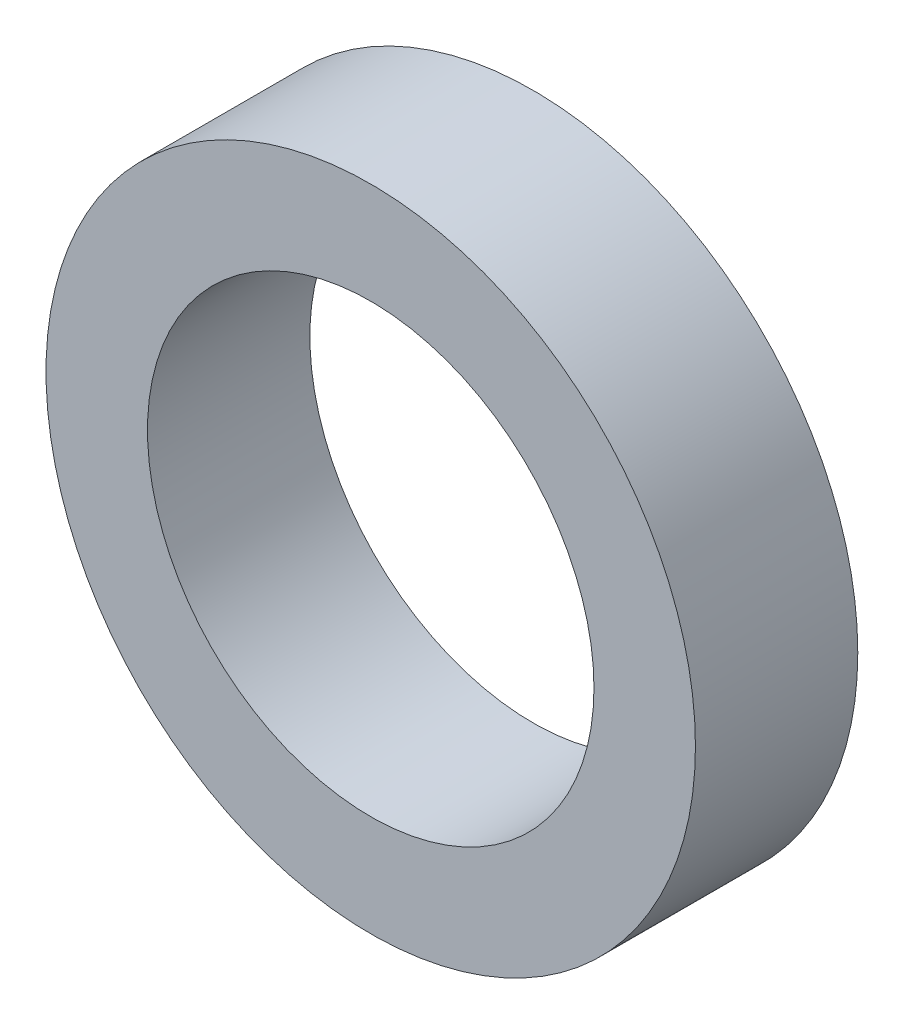
ISO-10303-21;
HEADER;
FILE_DESCRIPTION(('STEP AP214'),'2;1');
FILE_NAME('part.step','',(''),(''),'','','');
FILE_SCHEMA(('AUTOMOTIVE_DESIGN { 1 0 10303 214 1 1 1 1 }'));
ENDSEC;
DATA;
#1=APPLICATION_CONTEXT('core data for automotive mechanical design processes');
#2=APPLICATION_PROTOCOL_DEFINITION('international standard','automotive_design',2000,#1);
#3=PRODUCT_CONTEXT('',#1,'mechanical');
#4=PRODUCT('Part','Part','',(#3));
#5=PRODUCT_RELATED_PRODUCT_CATEGORY('part','',(#4));
#6=PRODUCT_DEFINITION_FORMATION('','',#4);
#7=PRODUCT_DEFINITION_CONTEXT('part definition',#1,'design');
#8=PRODUCT_DEFINITION('design','',#6,#7);
#9=PRODUCT_DEFINITION_SHAPE('','',#8);
#10=(LENGTH_UNIT() NAMED_UNIT(*) SI_UNIT(.MILLI.,.METRE.));
#11=(NAMED_UNIT(*) PLANE_ANGLE_UNIT() SI_UNIT($,.RADIAN.));
#12=(NAMED_UNIT(*) SI_UNIT($,.STERADIAN.) SOLID_ANGLE_UNIT());
#13=UNCERTAINTY_MEASURE_WITH_UNIT(LENGTH_MEASURE(1.E-05),#10,'distance_accuracy_value','');
#14=(GEOMETRIC_REPRESENTATION_CONTEXT(3) GLOBAL_UNCERTAINTY_ASSIGNED_CONTEXT((#13)) GLOBAL_UNIT_ASSIGNED_CONTEXT((#10,
#11,#12)) REPRESENTATION_CONTEXT('',''));
#15=CARTESIAN_POINT('',(0.,0.,0.));
#16=DIRECTION('',(0.,0.,1.));
#17=DIRECTION('',(1.,0.,0.));
#18=AXIS2_PLACEMENT_3D('',#15,#16,#17);
#19=CARTESIAN_POINT('',(0.,0.,4.));
#20=DIRECTION('',(0.,0.,1.));
#21=DIRECTION('',(1.,0.,0.));
#22=AXIS2_PLACEMENT_3D('',#19,#20,#21);
#23=PLANE('',#22);
#24=CARTESIAN_POINT('',(0.,0.,4.));
#25=DIRECTION('',(0.,0.,1.));
#26=DIRECTION('',(1.,0.,0.));
#27=AXIS2_PLACEMENT_3D('',#24,#25,#26);
#28=CIRCLE('',#27,8.);
#29=CARTESIAN_POINT('',(8.,0.,4.));
#30=VERTEX_POINT('',#29);
#31=EDGE_CURVE('E10',#30,#30,#28,.T.);
#32=ORIENTED_EDGE('',*,*,#31,.T.);
#33=EDGE_LOOP('',(#32));
#34=FACE_BOUND('',#33,.T.);
#35=CARTESIAN_POINT('',(0.,0.,4.));
#36=DIRECTION('',(0.,0.,1.));
#37=DIRECTION('',(1.,0.,0.));
#38=AXIS2_PLACEMENT_3D('',#35,#36,#37);
#39=CIRCLE('',#38,5.5);
#40=CARTESIAN_POINT('',(5.5,0.,4.));
#41=VERTEX_POINT('',#40);
#42=EDGE_CURVE('E42',#41,#41,#39,.T.);
#43=ORIENTED_EDGE('',*,*,#42,.F.);
#44=EDGE_LOOP('',(#43));
#45=FACE_BOUND('',#44,.T.);
#46=ADVANCED_FACE('F31',(#34,#45),#23,.T.);
#47=CARTESIAN_POINT('',(0.,0.,0.));
#48=DIRECTION('',(0.,0.,1.));
#49=DIRECTION('',(1.,0.,0.));
#50=AXIS2_PLACEMENT_3D('',#47,#48,#49);
#51=PLANE('',#50);
#52=CARTESIAN_POINT('',(0.,0.,0.));
#53=DIRECTION('',(0.,0.,1.));
#54=DIRECTION('',(1.,0.,0.));
#55=AXIS2_PLACEMENT_3D('',#52,#53,#54);
#56=CIRCLE('',#55,8.);
#57=CARTESIAN_POINT('',(8.,0.,0.));
#58=VERTEX_POINT('',#57);
#59=EDGE_CURVE('E35',#58,#58,#56,.T.);
#60=ORIENTED_EDGE('',*,*,#59,.F.);
#61=EDGE_LOOP('',(#60));
#62=FACE_BOUND('',#61,.T.);
#63=CARTESIAN_POINT('',(0.,0.,0.));
#64=DIRECTION('',(0.,0.,1.));
#65=DIRECTION('',(1.,0.,0.));
#66=AXIS2_PLACEMENT_3D('',#63,#64,#65);
#67=CIRCLE('',#66,5.5);
#68=CARTESIAN_POINT('',(5.5,0.,0.));
#69=VERTEX_POINT('',#68);
#70=EDGE_CURVE('E44',#69,#69,#67,.T.);
#71=ORIENTED_EDGE('',*,*,#70,.T.);
#72=EDGE_LOOP('',(#71));
#73=FACE_BOUND('',#72,.T.);
#74=ADVANCED_FACE('F54',(#62,#73),#51,.F.);
#75=CARTESIAN_POINT('',(0.,0.,4.));
#76=DIRECTION('',(0.,0.,-1.));
#77=DIRECTION('',(-1.,0.,0.));
#78=AXIS2_PLACEMENT_3D('',#75,#76,#77);
#79=CYLINDRICAL_SURFACE('',#78,8.);
#80=ORIENTED_EDGE('',*,*,#31,.F.);
#81=EDGE_LOOP('',(#80));
#82=FACE_BOUND('',#81,.T.);
#83=ORIENTED_EDGE('',*,*,#59,.T.);
#84=EDGE_LOOP('',(#83));
#85=FACE_BOUND('',#84,.T.);
#86=ADVANCED_FACE('F33',(#82,#85),#79,.T.);
#87=CARTESIAN_POINT('',(0.,0.,4.));
#88=DIRECTION('',(0.,0.,-1.));
#89=DIRECTION('',(-1.,0.,0.));
#90=AXIS2_PLACEMENT_3D('',#87,#88,#89);
#91=CYLINDRICAL_SURFACE('',#90,5.5);
#92=ORIENTED_EDGE('',*,*,#42,.T.);
#93=EDGE_LOOP('',(#92));
#94=FACE_BOUND('',#93,.T.);
#95=ORIENTED_EDGE('',*,*,#70,.F.);
#96=EDGE_LOOP('',(#95));
#97=FACE_BOUND('',#96,.T.);
#98=ADVANCED_FACE('F50',(#94,#97),#91,.F.);
#99=CLOSED_SHELL('',(#46,#74,#86,#98));
#100=MANIFOLD_SOLID_BREP('B2',#99);
#101=ADVANCED_BREP_SHAPE_REPRESENTATION('',(#18,#100),#14);
#102=SHAPE_DEFINITION_REPRESENTATION(#9,#101);
ENDSEC;
END-ISO-10303-21;
